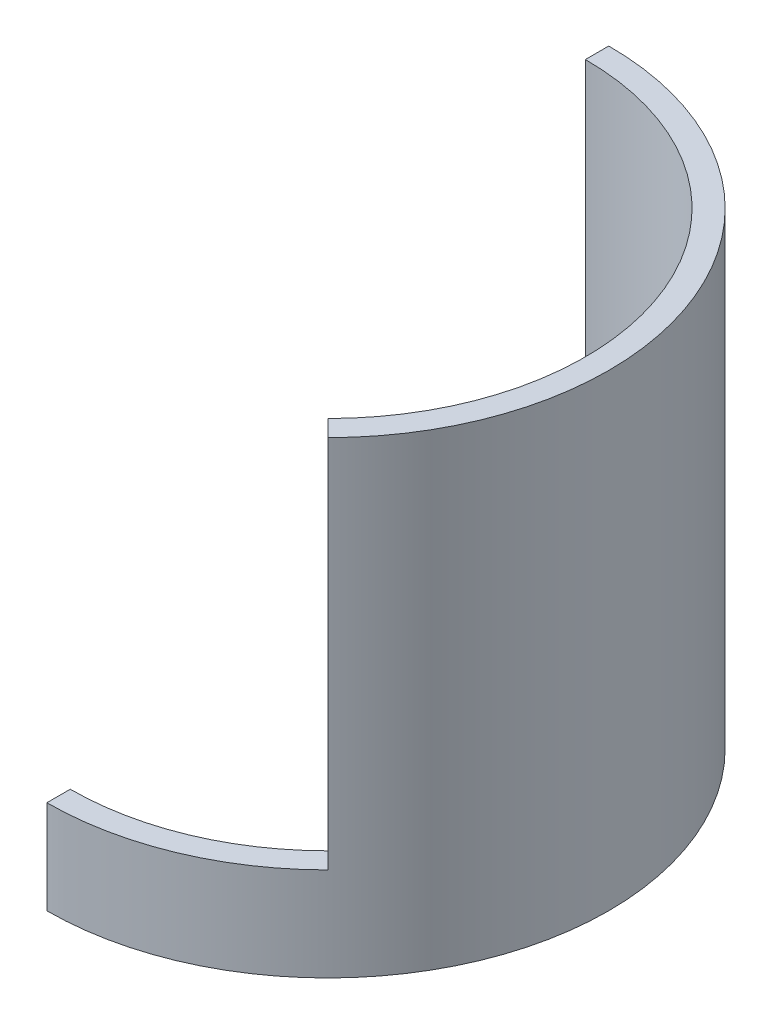
ISO-10303-21;
HEADER;
FILE_DESCRIPTION(('STEP AP214'),'2;1');
FILE_NAME('part.step','',(''),(''),'','','');
FILE_SCHEMA(('AUTOMOTIVE_DESIGN { 1 0 10303 214 1 1 1 1 }'));
ENDSEC;
DATA;
#1=APPLICATION_CONTEXT('core data for automotive mechanical design processes');
#2=APPLICATION_PROTOCOL_DEFINITION('international standard','automotive_design',2000,#1);
#3=PRODUCT_CONTEXT('',#1,'mechanical');
#4=PRODUCT('Part','Part','',(#3));
#5=PRODUCT_RELATED_PRODUCT_CATEGORY('part','',(#4));
#6=PRODUCT_DEFINITION_FORMATION('','',#4);
#7=PRODUCT_DEFINITION_CONTEXT('part definition',#1,'design');
#8=PRODUCT_DEFINITION('design','',#6,#7);
#9=PRODUCT_DEFINITION_SHAPE('','',#8);
#10=(LENGTH_UNIT() NAMED_UNIT(*) SI_UNIT(.MILLI.,.METRE.));
#11=(NAMED_UNIT(*) PLANE_ANGLE_UNIT() SI_UNIT($,.RADIAN.));
#12=(NAMED_UNIT(*) SI_UNIT($,.STERADIAN.) SOLID_ANGLE_UNIT());
#13=UNCERTAINTY_MEASURE_WITH_UNIT(LENGTH_MEASURE(1.E-05),#10,'distance_accuracy_value','');
#14=(GEOMETRIC_REPRESENTATION_CONTEXT(3) GLOBAL_UNCERTAINTY_ASSIGNED_CONTEXT((#13)) GLOBAL_UNIT_ASSIGNED_CONTEXT((#10,
#11,#12)) REPRESENTATION_CONTEXT('',''));
#15=CARTESIAN_POINT('',(0.,0.,0.));
#16=DIRECTION('',(0.,0.,1.));
#17=DIRECTION('',(1.,0.,0.));
#18=AXIS2_PLACEMENT_3D('',#15,#16,#17);
#19=CARTESIAN_POINT('',(0.,0.,0.));
#20=DIRECTION('',(1.,0.,0.));
#21=DIRECTION('',(0.,0.,-1.));
#22=AXIS2_PLACEMENT_3D('',#19,#20,#21);
#23=PLANE('',#22);
#24=DIRECTION('',(0.,0.,-1.));
#25=VECTOR('',#24,1.);
#26=CARTESIAN_POINT('',(0.,0.,107.830177644923));
#27=LINE('',#26,#25);
#28=CARTESIAN_POINT('',(0.,0.,152.494899658551));
#29=VERTEX_POINT('',#28);
#30=CARTESIAN_POINT('',(0.,0.,139.794899658551));
#31=VERTEX_POINT('',#30);
#32=EDGE_CURVE('E138',#29,#31,#27,.T.);
#33=ORIENTED_EDGE('',*,*,#32,.F.);
#34=DIRECTION('',(0.,-1.,0.));
#35=VECTOR('',#34,1.);
#36=CARTESIAN_POINT('',(0.,0.,152.494899658551));
#37=LINE('',#36,#35);
#38=CARTESIAN_POINT('',(0.,50.8,152.494899658551));
#39=VERTEX_POINT('',#38);
#40=EDGE_CURVE('E137',#29,#39,#37,.F.);
#41=ORIENTED_EDGE('',*,*,#40,.T.);
#42=DIRECTION('',(0.,0.,-1.));
#43=VECTOR('',#42,1.);
#44=CARTESIAN_POINT('',(0.,50.8,107.830177644923));
#45=LINE('',#44,#43);
#46=CARTESIAN_POINT('',(0.,50.8,139.794899658551));
#47=VERTEX_POINT('',#46);
#48=EDGE_CURVE('E51',#39,#47,#45,.T.);
#49=ORIENTED_EDGE('',*,*,#48,.T.);
#50=DIRECTION('',(0.,-1.,0.));
#51=VECTOR('',#50,1.);
#52=CARTESIAN_POINT('',(0.,0.,139.794899658551));
#53=LINE('',#52,#51);
#54=EDGE_CURVE('E46',#31,#47,#53,.F.);
#55=ORIENTED_EDGE('',*,*,#54,.F.);
#56=EDGE_LOOP('',(#33,#41,#49,#55));
#57=FACE_BOUND('',#56,.T.);
#58=ADVANCED_FACE('F43',(#57),#23,.F.);
#59=DIRECTION('',(0.,0.,-1.));
#60=VECTOR('',#59,1.);
#61=CARTESIAN_POINT('',(0.,254.,107.830177644925));
#62=LINE('',#61,#60);
#63=CARTESIAN_POINT('',(0.,254.,-139.794899658551));
#64=VERTEX_POINT('',#63);
#65=CARTESIAN_POINT('',(0.,254.,-152.494899658551));
#66=VERTEX_POINT('',#65);
#67=EDGE_CURVE('E11',#64,#66,#62,.T.);
#68=ORIENTED_EDGE('',*,*,#67,.T.);
#69=DIRECTION('',(0.,-1.,0.));
#70=VECTOR('',#69,1.);
#71=CARTESIAN_POINT('',(0.,0.,-152.494899658551));
#72=LINE('',#71,#70);
#73=CARTESIAN_POINT('',(0.,0.,-152.494899658551));
#74=VERTEX_POINT('',#73);
#75=EDGE_CURVE('E59',#66,#74,#72,.T.);
#76=ORIENTED_EDGE('',*,*,#75,.T.);
#77=CARTESIAN_POINT('',(0.,0.,-139.794899658551));
#78=VERTEX_POINT('',#77);
#79=EDGE_CURVE('E134',#78,#74,#27,.T.);
#80=ORIENTED_EDGE('',*,*,#79,.F.);
#81=DIRECTION('',(0.,-1.,0.));
#82=VECTOR('',#81,1.);
#83=CARTESIAN_POINT('',(0.,0.,-139.794899658551));
#84=LINE('',#83,#82);
#85=EDGE_CURVE('E65',#64,#78,#84,.T.);
#86=ORIENTED_EDGE('',*,*,#85,.F.);
#87=EDGE_LOOP('',(#68,#76,#80,#86));
#88=FACE_BOUND('',#87,.T.);
#89=ADVANCED_FACE('F152',(#88),#23,.F.);
#90=CARTESIAN_POINT('',(0.,0.,0.));
#91=DIRECTION('',(0.,-1.,0.));
#92=DIRECTION('',(0.,0.,-1.));
#93=AXIS2_PLACEMENT_3D('',#90,#91,#92);
#94=CYLINDRICAL_SURFACE('',#93,139.794899658551);
#95=CARTESIAN_POINT('',(0.,0.,0.));
#96=DIRECTION('',(0.,-1.,0.));
#97=DIRECTION('',(0.,0.,-1.));
#98=AXIS2_PLACEMENT_3D('',#95,#96,#97);
#99=CIRCLE('',#98,139.794899658551);
#100=EDGE_CURVE('E133',#78,#31,#99,.T.);
#101=ORIENTED_EDGE('',*,*,#100,.T.);
#102=ORIENTED_EDGE('',*,*,#54,.T.);
#103=CARTESIAN_POINT('',(0.,50.8,0.));
#104=DIRECTION('',(0.,-1.,0.));
#105=DIRECTION('',(0.,0.,-1.));
#106=AXIS2_PLACEMENT_3D('',#103,#104,#105);
#107=CIRCLE('',#106,139.794899658551);
#108=CARTESIAN_POINT('',(98.8499215238542,50.8,98.8499215238541));
#109=VERTEX_POINT('',#108);
#110=EDGE_CURVE('E112',#109,#47,#107,.T.);
#111=ORIENTED_EDGE('',*,*,#110,.F.);
#112=DIRECTION('',(0.,1.,0.));
#113=VECTOR('',#112,1.);
#114=CARTESIAN_POINT('',(98.8499215238542,0.,98.8499215238542));
#115=LINE('',#114,#113);
#116=CARTESIAN_POINT('',(98.8499215238541,254.,98.8499215238542));
#117=VERTEX_POINT('',#116);
#118=EDGE_CURVE('E108',#109,#117,#115,.T.);
#119=ORIENTED_EDGE('',*,*,#118,.T.);
#120=CARTESIAN_POINT('',(0.,254.,0.));
#121=DIRECTION('',(0.,-1.,0.));
#122=DIRECTION('',(0.,0.,-1.));
#123=AXIS2_PLACEMENT_3D('',#120,#121,#122);
#124=CIRCLE('',#123,139.794899658551);
#125=EDGE_CURVE('E97',#64,#117,#124,.T.);
#126=ORIENTED_EDGE('',*,*,#125,.F.);
#127=ORIENTED_EDGE('',*,*,#85,.T.);
#128=EDGE_LOOP('',(#101,#102,#111,#119,#126,#127));
#129=FACE_BOUND('',#128,.T.);
#130=ADVANCED_FACE('F110',(#129),#94,.F.);
#131=CARTESIAN_POINT('',(107.830177644923,0.,107.830177644923));
#132=DIRECTION('',(0.,1.,0.));
#133=DIRECTION('',(0.,0.,1.));
#134=AXIS2_PLACEMENT_3D('',#131,#132,#133);
#135=PLANE('',#134);
#136=CARTESIAN_POINT('',(0.,0.,0.));
#137=DIRECTION('',(0.,-1.,0.));
#138=DIRECTION('',(0.,0.,-1.));
#139=AXIS2_PLACEMENT_3D('',#136,#137,#138);
#140=CIRCLE('',#139,152.494899658551);
#141=EDGE_CURVE('E130',#74,#29,#140,.T.);
#142=ORIENTED_EDGE('',*,*,#141,.T.);
#143=ORIENTED_EDGE('',*,*,#32,.T.);
#144=ORIENTED_EDGE('',*,*,#100,.F.);
#145=ORIENTED_EDGE('',*,*,#79,.T.);
#146=EDGE_LOOP('',(#142,#143,#144,#145));
#147=FACE_BOUND('',#146,.T.);
#148=ADVANCED_FACE('F151',(#147),#135,.F.);
#149=CARTESIAN_POINT('',(0.,0.,0.));
#150=DIRECTION('',(0.,-1.,0.));
#151=DIRECTION('',(0.,0.,-1.));
#152=AXIS2_PLACEMENT_3D('',#149,#150,#151);
#153=CYLINDRICAL_SURFACE('',#152,152.494899658551);
#154=ORIENTED_EDGE('',*,*,#40,.F.);
#155=ORIENTED_EDGE('',*,*,#141,.F.);
#156=ORIENTED_EDGE('',*,*,#75,.F.);
#157=CARTESIAN_POINT('',(0.,254.,0.));
#158=DIRECTION('',(0.,-1.,0.));
#159=DIRECTION('',(0.,0.,-1.));
#160=AXIS2_PLACEMENT_3D('',#157,#158,#159);
#161=CIRCLE('',#160,152.494899658551);
#162=CARTESIAN_POINT('',(107.830177644923,254.,107.830177644923));
#163=VERTEX_POINT('',#162);
#164=EDGE_CURVE('E105',#66,#163,#161,.T.);
#165=ORIENTED_EDGE('',*,*,#164,.T.);
#166=DIRECTION('',(0.,1.,0.));
#167=VECTOR('',#166,1.);
#168=CARTESIAN_POINT('',(107.830177644923,0.,107.830177644923));
#169=LINE('',#168,#167);
#170=CARTESIAN_POINT('',(107.830177644923,50.8,107.830177644923));
#171=VERTEX_POINT('',#170);
#172=EDGE_CURVE('E120',#171,#163,#169,.T.);
#173=ORIENTED_EDGE('',*,*,#172,.F.);
#174=CARTESIAN_POINT('',(0.,50.8,0.));
#175=DIRECTION('',(0.,-1.,0.));
#176=DIRECTION('',(0.,0.,-1.));
#177=AXIS2_PLACEMENT_3D('',#174,#175,#176);
#178=CIRCLE('',#177,152.494899658551);
#179=EDGE_CURVE('E127',#171,#39,#178,.T.);
#180=ORIENTED_EDGE('',*,*,#179,.T.);
#181=EDGE_LOOP('',(#154,#155,#156,#165,#173,#180));
#182=FACE_BOUND('',#181,.T.);
#183=ADVANCED_FACE('F149',(#182),#153,.T.);
#184=CARTESIAN_POINT('',(107.830177644923,50.8,107.830177644923));
#185=DIRECTION('',(0.,1.,0.));
#186=DIRECTION('',(0.,0.,1.));
#187=AXIS2_PLACEMENT_3D('',#184,#185,#186);
#188=PLANE('',#187);
#189=ORIENTED_EDGE('',*,*,#48,.F.);
#190=ORIENTED_EDGE('',*,*,#179,.F.);
#191=DIRECTION('',(-0.707106781186548,0.,-0.707106781186548));
#192=VECTOR('',#191,1.);
#193=CARTESIAN_POINT('',(107.830177644923,50.8,107.830177644923));
#194=LINE('',#193,#192);
#195=EDGE_CURVE('E104',#171,#109,#194,.T.);
#196=ORIENTED_EDGE('',*,*,#195,.T.);
#197=ORIENTED_EDGE('',*,*,#110,.T.);
#198=EDGE_LOOP('',(#189,#190,#196,#197));
#199=FACE_BOUND('',#198,.T.);
#200=ADVANCED_FACE('F148',(#199),#188,.T.);
#201=CARTESIAN_POINT('',(-107.830177644922,254.,107.830177644925));
#202=DIRECTION('',(0.,1.,0.));
#203=DIRECTION('',(0.,0.,1.));
#204=AXIS2_PLACEMENT_3D('',#201,#202,#203);
#205=PLANE('',#204);
#206=ORIENTED_EDGE('',*,*,#67,.F.);
#207=ORIENTED_EDGE('',*,*,#125,.T.);
#208=DIRECTION('',(-0.707106781186548,0.,-0.707106781186548));
#209=VECTOR('',#208,1.);
#210=CARTESIAN_POINT('',(107.830177644923,254.,107.830177644923));
#211=LINE('',#210,#209);
#212=EDGE_CURVE('E102',#163,#117,#211,.T.);
#213=ORIENTED_EDGE('',*,*,#212,.F.);
#214=ORIENTED_EDGE('',*,*,#164,.F.);
#215=EDGE_LOOP('',(#206,#207,#213,#214));
#216=FACE_BOUND('',#215,.T.);
#217=ADVANCED_FACE('F99',(#216),#205,.T.);
#218=CARTESIAN_POINT('',(0.,0.,0.));
#219=DIRECTION('',(-0.707106781186548,0.,0.707106781186548));
#220=DIRECTION('',(0.707106781186548,0.,0.707106781186548));
#221=AXIS2_PLACEMENT_3D('',#218,#219,#220);
#222=PLANE('',#221);
#223=ORIENTED_EDGE('',*,*,#118,.F.);
#224=ORIENTED_EDGE('',*,*,#195,.F.);
#225=ORIENTED_EDGE('',*,*,#172,.T.);
#226=ORIENTED_EDGE('',*,*,#212,.T.);
#227=EDGE_LOOP('',(#223,#224,#225,#226));
#228=FACE_BOUND('',#227,.T.);
#229=ADVANCED_FACE('F118',(#228),#222,.T.);
#230=CLOSED_SHELL('',(#58,#89,#130,#148,#183,#200,#217,#229));
#231=MANIFOLD_SOLID_BREP('B2',#230);
#232=ADVANCED_BREP_SHAPE_REPRESENTATION('',(#18,#231),#14);
#233=SHAPE_DEFINITION_REPRESENTATION(#9,#232);
ENDSEC;
END-ISO-10303-21;
